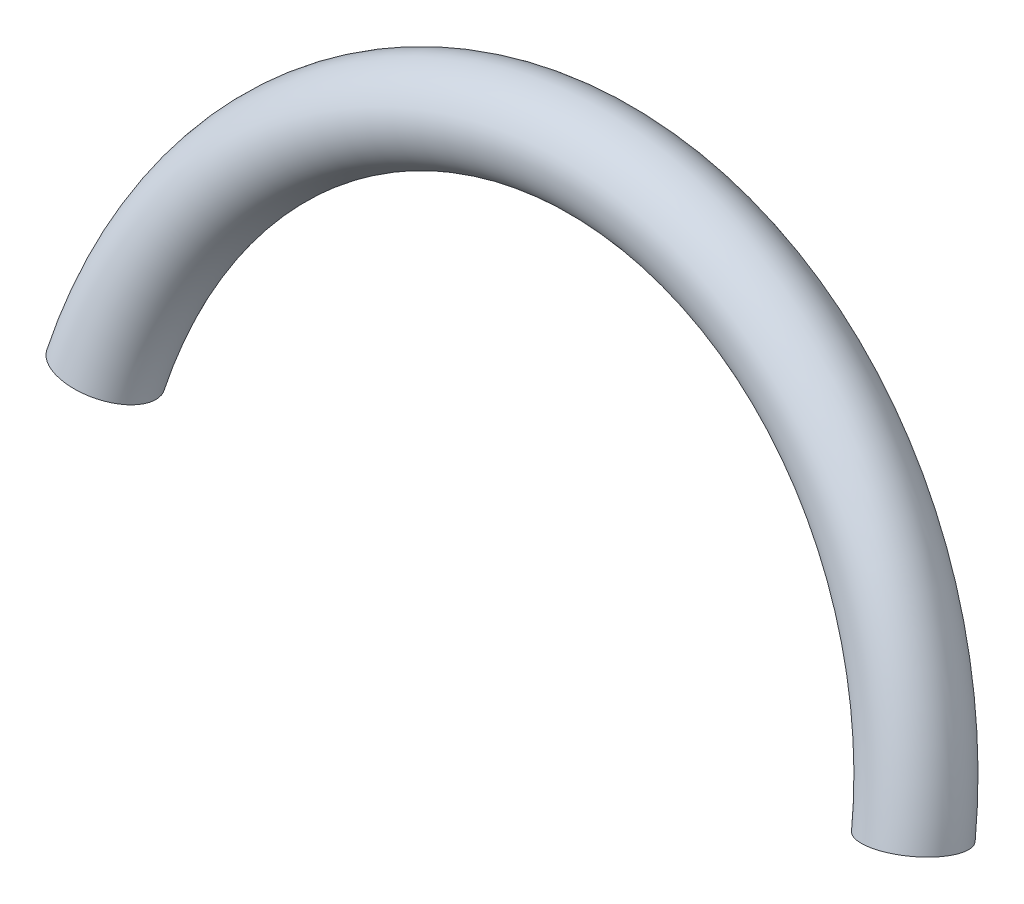
ISO-10303-21;
HEADER;
FILE_DESCRIPTION(('STEP AP214'),'2;1');
FILE_NAME('part.step','',(''),(''),'','','');
FILE_SCHEMA(('AUTOMOTIVE_DESIGN { 1 0 10303 214 1 1 1 1 }'));
ENDSEC;
DATA;
#1=APPLICATION_CONTEXT('core data for automotive mechanical design processes');
#2=APPLICATION_PROTOCOL_DEFINITION('international standard','automotive_design',2000,#1);
#3=PRODUCT_CONTEXT('',#1,'mechanical');
#4=PRODUCT('Part','Part','',(#3));
#5=PRODUCT_RELATED_PRODUCT_CATEGORY('part','',(#4));
#6=PRODUCT_DEFINITION_FORMATION('','',#4);
#7=PRODUCT_DEFINITION_CONTEXT('part definition',#1,'design');
#8=PRODUCT_DEFINITION('design','',#6,#7);
#9=PRODUCT_DEFINITION_SHAPE('','',#8);
#10=(LENGTH_UNIT() NAMED_UNIT(*) SI_UNIT(.MILLI.,.METRE.));
#11=(NAMED_UNIT(*) PLANE_ANGLE_UNIT() SI_UNIT($,.RADIAN.));
#12=(NAMED_UNIT(*) SI_UNIT($,.STERADIAN.) SOLID_ANGLE_UNIT());
#13=UNCERTAINTY_MEASURE_WITH_UNIT(LENGTH_MEASURE(1.E-05),#10,'distance_accuracy_value','');
#14=(GEOMETRIC_REPRESENTATION_CONTEXT(3) GLOBAL_UNCERTAINTY_ASSIGNED_CONTEXT((#13)) GLOBAL_UNIT_ASSIGNED_CONTEXT((#10,
#11,#12)) REPRESENTATION_CONTEXT('',''));
#15=CARTESIAN_POINT('',(0.,0.,0.));
#16=DIRECTION('',(0.,0.,1.));
#17=DIRECTION('',(1.,0.,0.));
#18=AXIS2_PLACEMENT_3D('',#15,#16,#17);
#19=CARTESIAN_POINT('',(0.,904.255410655569,-1942.29450703663));
#20=DIRECTION('',(0.,-0.258819045102518,-0.965925826289069));
#21=DIRECTION('',(0.,0.965925826289069,-0.258819045102518));
#22=AXIS2_PLACEMENT_3D('',#19,#20,#21);
#23=TOROIDAL_SURFACE('',#22,116.149429379517,11.3);
#24=CARTESIAN_POINT('',(-115.,920.,-1946.51325703663));
#25=DIRECTION('',(-0.140336447675245,-0.956366902675757,0.25625773923976));
#26=DIRECTION('',(0.,-0.258819045102461,-0.965925826289084));
#27=AXIS2_PLACEMENT_3D('',#24,#25,#26);
#28=CIRCLE('',#27,11.3);
#29=CARTESIAN_POINT('',(-126.188173777022,921.531766970725,-1946.92369275943));
#30=VERTEX_POINT('',#29);
#31=EDGE_CURVE('E49',#30,#30,#28,.T.);
#32=CARTESIAN_POINT('',(115.,920.,-1946.51325703663));
#33=DIRECTION('',(0.140336447675245,-0.956366902675727,0.256257739239872));
#34=DIRECTION('',(0.,-0.258819045102574,-0.965925826289054));
#35=AXIS2_PLACEMENT_3D('',#32,#33,#34);
#36=CIRCLE('',#35,11.3);
#37=CARTESIAN_POINT('',(126.188173777022,921.531766970725,-1946.92369275943));
#38=VERTEX_POINT('',#37);
#39=EDGE_CURVE('E10',#38,#38,#36,.T.);
#40=CARTESIAN_POINT('',(0.,904.255410655569,-1942.29450703663));
#41=DIRECTION('',(0.,-0.258819045102518,-0.965925826289069));
#42=DIRECTION('',(0.,0.965925826289069,-0.258819045102518));
#43=AXIS2_PLACEMENT_3D('',#40,#41,#42);
#44=CIRCLE('',#43,127.449429379517);
#45=EDGE_CURVE('',#30,#38,#44,.T.);
#46=ORIENTED_EDGE('',*,*,#31,.T.);
#47=ORIENTED_EDGE('',*,*,#39,.T.);
#48=ORIENTED_EDGE('',*,*,#45,.T.);
#49=ORIENTED_EDGE('',*,*,#45,.F.);
#50=EDGE_LOOP('',(#46,#48,#47,#49));
#51=FACE_BOUND('',#50,.T.);
#52=ADVANCED_FACE('F39',(#51),#23,.F.);
#53=CARTESIAN_POINT('',(115.,920.,-1946.51325703663));
#54=DIRECTION('',(0.140336447675245,-0.956366902675727,0.256257739239872));
#55=DIRECTION('',(0.,-0.258819045102574,-0.965925826289054));
#56=AXIS2_PLACEMENT_3D('',#53,#54,#55);
#57=PLANE('',#56);
#58=ORIENTED_EDGE('',*,*,#39,.F.);
#59=EDGE_LOOP('',(#58));
#60=FACE_BOUND('',#59,.T.);
#61=CARTESIAN_POINT('',(115.,920.,-1946.51325703663));
#62=DIRECTION('',(0.140336447675245,-0.956366902675727,0.256257739239872));
#63=DIRECTION('',(0.,-0.258819045102574,-0.965925826289054));
#64=AXIS2_PLACEMENT_3D('',#61,#62,#63);
#65=CIRCLE('',#64,12.5);
#66=CARTESIAN_POINT('',(127.37629842591,921.69443248974,-1946.96727885388));
#67=VERTEX_POINT('',#66);
#68=EDGE_CURVE('E45',#67,#67,#65,.F.);
#69=ORIENTED_EDGE('',*,*,#68,.F.);
#70=EDGE_LOOP('',(#69));
#71=FACE_BOUND('',#70,.T.);
#72=ADVANCED_FACE('F69',(#60,#71),#57,.T.);
#73=CARTESIAN_POINT('',(0.,904.255410655569,-1942.29450703663));
#74=DIRECTION('',(0.,-0.258819045102518,-0.965925826289069));
#75=DIRECTION('',(0.,0.965925826289069,-0.258819045102518));
#76=AXIS2_PLACEMENT_3D('',#73,#74,#75);
#77=TOROIDAL_SURFACE('',#76,116.149429379517,12.5);
#78=CARTESIAN_POINT('',(-115.,920.,-1946.51325703663));
#79=DIRECTION('',(-0.140336447675245,-0.956366902675757,0.25625773923976));
#80=DIRECTION('',(0.,-0.258819045102461,-0.965925826289084));
#81=AXIS2_PLACEMENT_3D('',#78,#79,#80);
#82=CIRCLE('',#81,12.5);
#83=CARTESIAN_POINT('',(-127.37629842591,921.69443248974,-1946.96727885388));
#84=VERTEX_POINT('',#83);
#85=EDGE_CURVE('E53',#84,#84,#82,.F.);
#86=CARTESIAN_POINT('',(0.,904.255410655569,-1942.29450703663));
#87=DIRECTION('',(0.,-0.258819045102518,-0.965925826289069));
#88=DIRECTION('',(0.,0.965925826289069,-0.258819045102518));
#89=AXIS2_PLACEMENT_3D('',#86,#87,#88);
#90=CIRCLE('',#89,128.649429379517);
#91=EDGE_CURVE('',#84,#67,#90,.T.);
#92=ORIENTED_EDGE('',*,*,#85,.T.);
#93=ORIENTED_EDGE('',*,*,#68,.T.);
#94=ORIENTED_EDGE('',*,*,#91,.T.);
#95=ORIENTED_EDGE('',*,*,#91,.F.);
#96=EDGE_LOOP('',(#92,#94,#93,#95));
#97=FACE_BOUND('',#96,.T.);
#98=ADVANCED_FACE('F59',(#97),#77,.T.);
#99=CARTESIAN_POINT('',(-115.,920.,-1946.51325703663));
#100=DIRECTION('',(-0.140336447675245,-0.956366902675757,0.25625773923976));
#101=DIRECTION('',(0.,-0.258819045102461,-0.965925826289084));
#102=AXIS2_PLACEMENT_3D('',#99,#100,#101);
#103=PLANE('',#102);
#104=ORIENTED_EDGE('',*,*,#31,.F.);
#105=EDGE_LOOP('',(#104));
#106=FACE_BOUND('',#105,.T.);
#107=ORIENTED_EDGE('',*,*,#85,.F.);
#108=EDGE_LOOP('',(#107));
#109=FACE_BOUND('',#108,.T.);
#110=ADVANCED_FACE('F61',(#106,#109),#103,.T.);
#111=CLOSED_SHELL('',(#52,#72,#98,#110));
#112=MANIFOLD_SOLID_BREP('B2',#111);
#113=ADVANCED_BREP_SHAPE_REPRESENTATION('',(#18,#112),#14);
#114=SHAPE_DEFINITION_REPRESENTATION(#9,#113);
ENDSEC;
END-ISO-10303-21;
